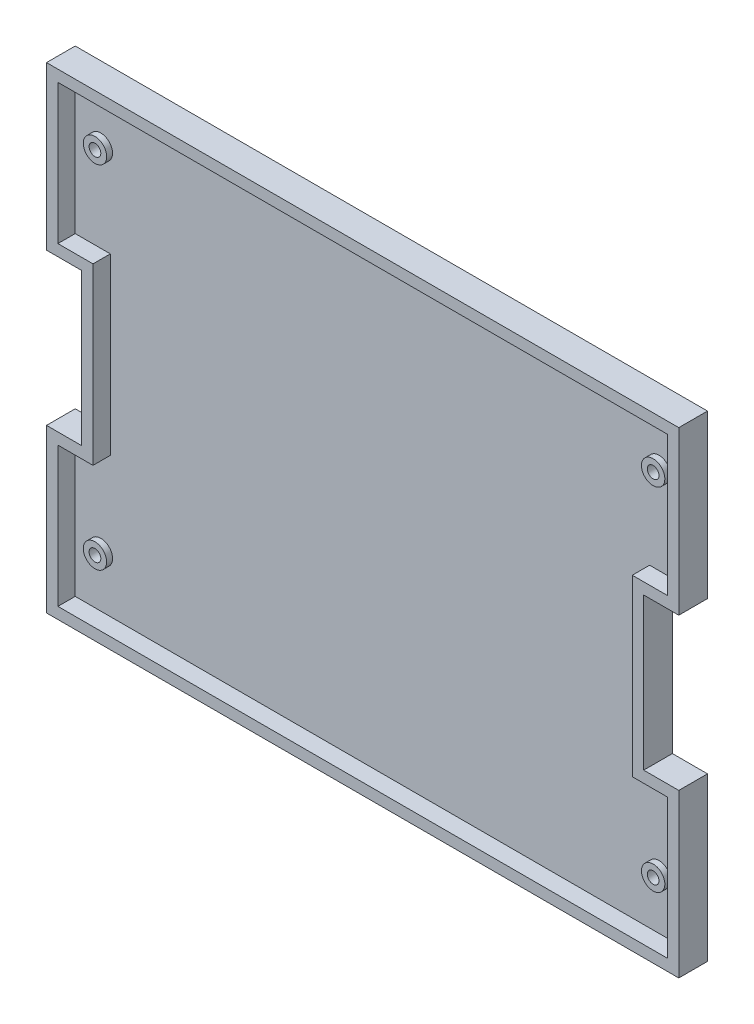
ISO-10303-21;
HEADER;
FILE_DESCRIPTION(('STEP AP214'),'2;1');
FILE_NAME('part.step','',(''),(''),'','','');
FILE_SCHEMA(('AUTOMOTIVE_DESIGN { 1 0 10303 214 1 1 1 1 }'));
ENDSEC;
DATA;
#1=APPLICATION_CONTEXT('core data for automotive mechanical design processes');
#2=APPLICATION_PROTOCOL_DEFINITION('international standard','automotive_design',2000,#1);
#3=PRODUCT_CONTEXT('',#1,'mechanical');
#4=PRODUCT('Part','Part','',(#3));
#5=PRODUCT_RELATED_PRODUCT_CATEGORY('part','',(#4));
#6=PRODUCT_DEFINITION_FORMATION('','',#4);
#7=PRODUCT_DEFINITION_CONTEXT('part definition',#1,'design');
#8=PRODUCT_DEFINITION('design','',#6,#7);
#9=PRODUCT_DEFINITION_SHAPE('','',#8);
#10=(LENGTH_UNIT() NAMED_UNIT(*) SI_UNIT(.MILLI.,.METRE.));
#11=(NAMED_UNIT(*) PLANE_ANGLE_UNIT() SI_UNIT($,.RADIAN.));
#12=(NAMED_UNIT(*) SI_UNIT($,.STERADIAN.) SOLID_ANGLE_UNIT());
#13=UNCERTAINTY_MEASURE_WITH_UNIT(LENGTH_MEASURE(1.E-05),#10,'distance_accuracy_value','');
#14=(GEOMETRIC_REPRESENTATION_CONTEXT(3) GLOBAL_UNCERTAINTY_ASSIGNED_CONTEXT((#13)) GLOBAL_UNIT_ASSIGNED_CONTEXT((#10,
#11,#12)) REPRESENTATION_CONTEXT('',''));
#15=CARTESIAN_POINT('',(0.,0.,0.));
#16=DIRECTION('',(0.,0.,1.));
#17=DIRECTION('',(1.,0.,0.));
#18=AXIS2_PLACEMENT_3D('',#15,#16,#17);
#19=CARTESIAN_POINT('',(0.,0.,4.91));
#20=DIRECTION('',(0.,0.,1.));
#21=DIRECTION('',(1.,0.,0.));
#22=AXIS2_PLACEMENT_3D('',#19,#20,#21);
#23=PLANE('',#22);
#24=DIRECTION('',(1.,0.,0.));
#25=VECTOR('',#24,1.);
#26=CARTESIAN_POINT('',(0.,-12.97,4.91));
#27=LINE('',#26,#25);
#28=CARTESIAN_POINT('',(48.055,-12.97,4.91));
#29=VERTEX_POINT('',#28);
#30=CARTESIAN_POINT('',(54.055,-12.97,4.91));
#31=VERTEX_POINT('',#30);
#32=EDGE_CURVE('E207',#29,#31,#27,.T.);
#33=ORIENTED_EDGE('',*,*,#32,.F.);
#34=DIRECTION('',(0.,1.,0.));
#35=VECTOR('',#34,1.);
#36=CARTESIAN_POINT('',(48.055,0.,4.91));
#37=LINE('',#36,#35);
#38=CARTESIAN_POINT('',(48.055,12.97,4.91));
#39=VERTEX_POINT('',#38);
#40=EDGE_CURVE('E204',#29,#39,#37,.T.);
#41=ORIENTED_EDGE('',*,*,#40,.T.);
#42=DIRECTION('',(1.,0.,0.));
#43=VECTOR('',#42,1.);
#44=CARTESIAN_POINT('',(0.,12.97,4.91));
#45=LINE('',#44,#43);
#46=CARTESIAN_POINT('',(54.055,12.97,4.91));
#47=VERTEX_POINT('',#46);
#48=EDGE_CURVE('E199',#39,#47,#45,.T.);
#49=ORIENTED_EDGE('',*,*,#48,.T.);
#50=DIRECTION('',(0.,1.,0.));
#51=VECTOR('',#50,1.);
#52=CARTESIAN_POINT('',(54.055,0.,4.91));
#53=LINE('',#52,#51);
#54=CARTESIAN_POINT('',(54.055,40.75,4.91));
#55=VERTEX_POINT('',#54);
#56=EDGE_CURVE('E195',#47,#55,#53,.T.);
#57=ORIENTED_EDGE('',*,*,#56,.T.);
#58=DIRECTION('',(1.,0.,0.));
#59=VECTOR('',#58,1.);
#60=CARTESIAN_POINT('',(0.,40.75,4.91));
#61=LINE('',#60,#59);
#62=CARTESIAN_POINT('',(-54.055,40.75,4.91));
#63=VERTEX_POINT('',#62);
#64=EDGE_CURVE('E188',#63,#55,#61,.T.);
#65=ORIENTED_EDGE('',*,*,#64,.F.);
#66=DIRECTION('',(0.,1.,0.));
#67=VECTOR('',#66,1.);
#68=CARTESIAN_POINT('',(-54.055,0.,4.91));
#69=LINE('',#68,#67);
#70=CARTESIAN_POINT('',(-54.055,12.97,4.91));
#71=VERTEX_POINT('',#70);
#72=EDGE_CURVE('E179',#71,#63,#69,.T.);
#73=ORIENTED_EDGE('',*,*,#72,.F.);
#74=DIRECTION('',(-1.,0.,0.));
#75=VECTOR('',#74,1.);
#76=CARTESIAN_POINT('',(0.,12.97,4.91));
#77=LINE('',#76,#75);
#78=CARTESIAN_POINT('',(-48.055,12.97,4.91));
#79=VERTEX_POINT('',#78);
#80=EDGE_CURVE('E187',#79,#71,#77,.T.);
#81=ORIENTED_EDGE('',*,*,#80,.F.);
#82=DIRECTION('',(0.,1.,0.));
#83=VECTOR('',#82,1.);
#84=CARTESIAN_POINT('',(-48.055,0.,4.91));
#85=LINE('',#84,#83);
#86=CARTESIAN_POINT('',(-48.055,-12.97,4.91));
#87=VERTEX_POINT('',#86);
#88=EDGE_CURVE('E181',#87,#79,#85,.T.);
#89=ORIENTED_EDGE('',*,*,#88,.F.);
#90=DIRECTION('',(-1.,0.,0.));
#91=VECTOR('',#90,1.);
#92=CARTESIAN_POINT('',(0.,-12.97,4.91));
#93=LINE('',#92,#91);
#94=CARTESIAN_POINT('',(-54.055,-12.97,4.91));
#95=VERTEX_POINT('',#94);
#96=EDGE_CURVE('E175',#87,#95,#93,.T.);
#97=ORIENTED_EDGE('',*,*,#96,.T.);
#98=CARTESIAN_POINT('',(-54.055,-40.75,4.91));
#99=VERTEX_POINT('',#98);
#100=EDGE_CURVE('E157',#99,#95,#69,.T.);
#101=ORIENTED_EDGE('',*,*,#100,.F.);
#102=DIRECTION('',(1.,0.,0.));
#103=VECTOR('',#102,1.);
#104=CARTESIAN_POINT('',(0.,-40.75,4.91));
#105=LINE('',#104,#103);
#106=CARTESIAN_POINT('',(54.055,-40.75,4.91));
#107=VERTEX_POINT('',#106);
#108=EDGE_CURVE('E167',#99,#107,#105,.T.);
#109=ORIENTED_EDGE('',*,*,#108,.T.);
#110=EDGE_CURVE('E74',#107,#31,#53,.T.);
#111=ORIENTED_EDGE('',*,*,#110,.T.);
#112=EDGE_LOOP('',(#33,#41,#49,#57,#65,#73,#81,#89,#97,#101,#109,#111));
#113=FACE_BOUND('',#112,.T.);
#114=DIRECTION('',(0.,1.,0.));
#115=VECTOR('',#114,1.);
#116=CARTESIAN_POINT('',(46.105,0.,4.91));
#117=LINE('',#116,#115);
#118=CARTESIAN_POINT('',(46.105,-14.92,4.91));
#119=VERTEX_POINT('',#118);
#120=CARTESIAN_POINT('',(46.105,14.92,4.91));
#121=VERTEX_POINT('',#120);
#122=EDGE_CURVE('E250',#119,#121,#117,.T.);
#123=ORIENTED_EDGE('',*,*,#122,.F.);
#124=DIRECTION('',(1.,0.,0.));
#125=VECTOR('',#124,1.);
#126=CARTESIAN_POINT('',(0.,-14.92,4.91));
#127=LINE('',#126,#125);
#128=CARTESIAN_POINT('',(52.105,-14.92,4.91));
#129=VERTEX_POINT('',#128);
#130=EDGE_CURVE('E254',#119,#129,#127,.T.);
#131=ORIENTED_EDGE('',*,*,#130,.T.);
#132=DIRECTION('',(0.,1.,0.));
#133=VECTOR('',#132,1.);
#134=CARTESIAN_POINT('',(52.105,0.,4.91));
#135=LINE('',#134,#133);
#136=CARTESIAN_POINT('',(52.105,-38.8,4.91));
#137=VERTEX_POINT('',#136);
#138=EDGE_CURVE('E211',#137,#129,#135,.T.);
#139=ORIENTED_EDGE('',*,*,#138,.F.);
#140=DIRECTION('',(1.,0.,0.));
#141=VECTOR('',#140,1.);
#142=CARTESIAN_POINT('',(0.,-38.8,4.91));
#143=LINE('',#142,#141);
#144=CARTESIAN_POINT('',(-52.105,-38.8,4.91));
#145=VERTEX_POINT('',#144);
#146=EDGE_CURVE('E215',#145,#137,#143,.T.);
#147=ORIENTED_EDGE('',*,*,#146,.F.);
#148=DIRECTION('',(0.,1.,0.));
#149=VECTOR('',#148,1.);
#150=CARTESIAN_POINT('',(-52.105,0.,4.91));
#151=LINE('',#150,#149);
#152=CARTESIAN_POINT('',(-52.105,-14.92,4.91));
#153=VERTEX_POINT('',#152);
#154=EDGE_CURVE('E218',#145,#153,#151,.T.);
#155=ORIENTED_EDGE('',*,*,#154,.T.);
#156=DIRECTION('',(-1.,0.,0.));
#157=VECTOR('',#156,1.);
#158=CARTESIAN_POINT('',(0.,-14.92,4.91));
#159=LINE('',#158,#157);
#160=CARTESIAN_POINT('',(-46.105,-14.92,4.91));
#161=VERTEX_POINT('',#160);
#162=EDGE_CURVE('E222',#161,#153,#159,.T.);
#163=ORIENTED_EDGE('',*,*,#162,.F.);
#164=DIRECTION('',(0.,1.,0.));
#165=VECTOR('',#164,1.);
#166=CARTESIAN_POINT('',(-46.105,0.,4.91));
#167=LINE('',#166,#165);
#168=CARTESIAN_POINT('',(-46.105,14.92,4.91));
#169=VERTEX_POINT('',#168);
#170=EDGE_CURVE('E226',#161,#169,#167,.T.);
#171=ORIENTED_EDGE('',*,*,#170,.T.);
#172=DIRECTION('',(-1.,0.,0.));
#173=VECTOR('',#172,1.);
#174=CARTESIAN_POINT('',(0.,14.92,4.91));
#175=LINE('',#174,#173);
#176=CARTESIAN_POINT('',(-52.105,14.92,4.91));
#177=VERTEX_POINT('',#176);
#178=EDGE_CURVE('E230',#169,#177,#175,.T.);
#179=ORIENTED_EDGE('',*,*,#178,.T.);
#180=DIRECTION('',(0.,1.,0.));
#181=VECTOR('',#180,1.);
#182=CARTESIAN_POINT('',(-52.105,0.,4.91));
#183=LINE('',#182,#181);
#184=CARTESIAN_POINT('',(-52.105,38.8,4.91));
#185=VERTEX_POINT('',#184);
#186=EDGE_CURVE('E234',#177,#185,#183,.T.);
#187=ORIENTED_EDGE('',*,*,#186,.T.);
#188=DIRECTION('',(1.,0.,0.));
#189=VECTOR('',#188,1.);
#190=CARTESIAN_POINT('',(0.,38.8,4.91));
#191=LINE('',#190,#189);
#192=CARTESIAN_POINT('',(52.105,38.8,4.91));
#193=VERTEX_POINT('',#192);
#194=EDGE_CURVE('E238',#185,#193,#191,.T.);
#195=ORIENTED_EDGE('',*,*,#194,.T.);
#196=DIRECTION('',(0.,1.,0.));
#197=VECTOR('',#196,1.);
#198=CARTESIAN_POINT('',(52.105,0.,4.91));
#199=LINE('',#198,#197);
#200=CARTESIAN_POINT('',(52.105,14.92,4.91));
#201=VERTEX_POINT('',#200);
#202=EDGE_CURVE('E242',#201,#193,#199,.T.);
#203=ORIENTED_EDGE('',*,*,#202,.F.);
#204=DIRECTION('',(1.,0.,0.));
#205=VECTOR('',#204,1.);
#206=CARTESIAN_POINT('',(0.,14.92,4.91));
#207=LINE('',#206,#205);
#208=EDGE_CURVE('E246',#121,#201,#207,.T.);
#209=ORIENTED_EDGE('',*,*,#208,.F.);
#210=EDGE_LOOP('',(#123,#131,#139,#147,#155,#163,#171,#179,#187,#195,#203,#209));
#211=FACE_BOUND('',#210,.T.);
#212=ADVANCED_FACE('F47',(#113,#211),#23,.T.);
#213=CARTESIAN_POINT('',(0.,-12.97,4.91));
#214=DIRECTION('',(0.,1.,0.));
#215=DIRECTION('',(0.,0.,1.));
#216=AXIS2_PLACEMENT_3D('',#213,#214,#215);
#217=PLANE('',#216);
#218=DIRECTION('',(1.,0.,0.));
#219=VECTOR('',#218,1.);
#220=CARTESIAN_POINT('',(0.,-12.97,0.));
#221=LINE('',#220,#219);
#222=CARTESIAN_POINT('',(48.055,-12.97,0.));
#223=VERTEX_POINT('',#222);
#224=CARTESIAN_POINT('',(54.055,-12.97,0.));
#225=VERTEX_POINT('',#224);
#226=EDGE_CURVE('E348',#223,#225,#221,.T.);
#227=ORIENTED_EDGE('',*,*,#226,.F.);
#228=DIRECTION('',(0.,0.,-1.));
#229=VECTOR('',#228,1.);
#230=CARTESIAN_POINT('',(48.055,-12.97,4.91));
#231=LINE('',#230,#229);
#232=EDGE_CURVE('E11',#29,#223,#231,.T.);
#233=ORIENTED_EDGE('',*,*,#232,.F.);
#234=ORIENTED_EDGE('',*,*,#32,.T.);
#235=DIRECTION('',(0.,0.,-1.));
#236=VECTOR('',#235,1.);
#237=CARTESIAN_POINT('',(54.055,-12.97,4.91));
#238=LINE('',#237,#236);
#239=EDGE_CURVE('E118',#31,#225,#238,.T.);
#240=ORIENTED_EDGE('',*,*,#239,.T.);
#241=EDGE_LOOP('',(#227,#233,#234,#240));
#242=FACE_BOUND('',#241,.T.);
#243=ADVANCED_FACE('F49',(#242),#217,.T.);
#244=CARTESIAN_POINT('',(48.055,0.,4.91));
#245=DIRECTION('',(-1.,0.,0.));
#246=DIRECTION('',(0.,0.,1.));
#247=AXIS2_PLACEMENT_3D('',#244,#245,#246);
#248=PLANE('',#247);
#249=DIRECTION('',(0.,1.,0.));
#250=VECTOR('',#249,1.);
#251=CARTESIAN_POINT('',(48.055,0.,0.));
#252=LINE('',#251,#250);
#253=CARTESIAN_POINT('',(48.055,12.97,0.));
#254=VERTEX_POINT('',#253);
#255=EDGE_CURVE('E481',#223,#254,#252,.T.);
#256=ORIENTED_EDGE('',*,*,#255,.T.);
#257=DIRECTION('',(0.,0.,-1.));
#258=VECTOR('',#257,1.);
#259=CARTESIAN_POINT('',(48.055,12.97,4.91));
#260=LINE('',#259,#258);
#261=EDGE_CURVE('E57',#39,#254,#260,.T.);
#262=ORIENTED_EDGE('',*,*,#261,.F.);
#263=ORIENTED_EDGE('',*,*,#40,.F.);
#264=ORIENTED_EDGE('',*,*,#232,.T.);
#265=EDGE_LOOP('',(#256,#262,#263,#264));
#266=FACE_BOUND('',#265,.T.);
#267=ADVANCED_FACE('F438',(#266),#248,.F.);
#268=CARTESIAN_POINT('',(0.,12.97,4.91));
#269=DIRECTION('',(0.,1.,0.));
#270=DIRECTION('',(-1.,0.,0.));
#271=AXIS2_PLACEMENT_3D('',#268,#269,#270);
#272=PLANE('',#271);
#273=DIRECTION('',(1.,0.,0.));
#274=VECTOR('',#273,1.);
#275=CARTESIAN_POINT('',(0.,12.97,0.));
#276=LINE('',#275,#274);
#277=CARTESIAN_POINT('',(54.055,12.97,0.));
#278=VERTEX_POINT('',#277);
#279=EDGE_CURVE('E488',#254,#278,#276,.T.);
#280=ORIENTED_EDGE('',*,*,#279,.T.);
#281=DIRECTION('',(0.,0.,-1.));
#282=VECTOR('',#281,1.);
#283=CARTESIAN_POINT('',(54.055,12.97,4.91));
#284=LINE('',#283,#282);
#285=EDGE_CURVE('E493',#47,#278,#284,.T.);
#286=ORIENTED_EDGE('',*,*,#285,.F.);
#287=ORIENTED_EDGE('',*,*,#48,.F.);
#288=ORIENTED_EDGE('',*,*,#261,.T.);
#289=EDGE_LOOP('',(#280,#286,#287,#288));
#290=FACE_BOUND('',#289,.T.);
#291=ADVANCED_FACE('F472',(#290),#272,.F.);
#292=CARTESIAN_POINT('',(54.055,0.,4.91));
#293=DIRECTION('',(-1.,0.,0.));
#294=DIRECTION('',(0.,0.,1.));
#295=AXIS2_PLACEMENT_3D('',#292,#293,#294);
#296=PLANE('',#295);
#297=DIRECTION('',(0.,1.,0.));
#298=VECTOR('',#297,1.);
#299=CARTESIAN_POINT('',(54.055,0.,0.));
#300=LINE('',#299,#298);
#301=CARTESIAN_POINT('',(54.055,40.75,0.));
#302=VERTEX_POINT('',#301);
#303=EDGE_CURVE('E498',#278,#302,#300,.T.);
#304=ORIENTED_EDGE('',*,*,#303,.T.);
#305=DIRECTION('',(0.,0.,-1.));
#306=VECTOR('',#305,1.);
#307=CARTESIAN_POINT('',(54.055,40.75,4.91));
#308=LINE('',#307,#306);
#309=EDGE_CURVE('E545',#55,#302,#308,.T.);
#310=ORIENTED_EDGE('',*,*,#309,.F.);
#311=ORIENTED_EDGE('',*,*,#56,.F.);
#312=ORIENTED_EDGE('',*,*,#285,.T.);
#313=EDGE_LOOP('',(#304,#310,#311,#312));
#314=FACE_BOUND('',#313,.T.);
#315=ADVANCED_FACE('F451',(#314),#296,.F.);
#316=CARTESIAN_POINT('',(0.,40.75,4.91));
#317=DIRECTION('',(0.,1.,0.));
#318=DIRECTION('',(0.,0.,1.));
#319=AXIS2_PLACEMENT_3D('',#316,#317,#318);
#320=PLANE('',#319);
#321=DIRECTION('',(1.,0.,0.));
#322=VECTOR('',#321,1.);
#323=CARTESIAN_POINT('',(0.,40.75,0.));
#324=LINE('',#323,#322);
#325=CARTESIAN_POINT('',(-54.055,40.75,0.));
#326=VERTEX_POINT('',#325);
#327=EDGE_CURVE('E502',#326,#302,#324,.T.);
#328=ORIENTED_EDGE('',*,*,#327,.F.);
#329=DIRECTION('',(0.,0.,-1.));
#330=VECTOR('',#329,1.);
#331=CARTESIAN_POINT('',(-54.055,40.75,4.91));
#332=LINE('',#331,#330);
#333=EDGE_CURVE('E542',#63,#326,#332,.T.);
#334=ORIENTED_EDGE('',*,*,#333,.F.);
#335=ORIENTED_EDGE('',*,*,#64,.T.);
#336=ORIENTED_EDGE('',*,*,#309,.T.);
#337=EDGE_LOOP('',(#328,#334,#335,#336));
#338=FACE_BOUND('',#337,.T.);
#339=ADVANCED_FACE('F469',(#338),#320,.T.);
#340=CARTESIAN_POINT('',(-54.055,0.,4.91));
#341=DIRECTION('',(-1.,0.,0.));
#342=DIRECTION('',(0.,0.,1.));
#343=AXIS2_PLACEMENT_3D('',#340,#341,#342);
#344=PLANE('',#343);
#345=DIRECTION('',(0.,1.,0.));
#346=VECTOR('',#345,1.);
#347=CARTESIAN_POINT('',(-54.055,0.,0.));
#348=LINE('',#347,#346);
#349=CARTESIAN_POINT('',(-54.055,12.97,0.));
#350=VERTEX_POINT('',#349);
#351=EDGE_CURVE('E508',#350,#326,#348,.T.);
#352=ORIENTED_EDGE('',*,*,#351,.F.);
#353=DIRECTION('',(0.,0.,-1.));
#354=VECTOR('',#353,1.);
#355=CARTESIAN_POINT('',(-54.055,12.97,4.91));
#356=LINE('',#355,#354);
#357=EDGE_CURVE('E539',#71,#350,#356,.T.);
#358=ORIENTED_EDGE('',*,*,#357,.F.);
#359=ORIENTED_EDGE('',*,*,#72,.T.);
#360=ORIENTED_EDGE('',*,*,#333,.T.);
#361=EDGE_LOOP('',(#352,#358,#359,#360));
#362=FACE_BOUND('',#361,.T.);
#363=ADVANCED_FACE('F457',(#362),#344,.T.);
#364=CARTESIAN_POINT('',(0.,12.97,4.91));
#365=DIRECTION('',(0.,-1.,0.));
#366=DIRECTION('',(1.,0.,0.));
#367=AXIS2_PLACEMENT_3D('',#364,#365,#366);
#368=PLANE('',#367);
#369=DIRECTION('',(-1.,0.,0.));
#370=VECTOR('',#369,1.);
#371=CARTESIAN_POINT('',(0.,12.97,0.));
#372=LINE('',#371,#370);
#373=CARTESIAN_POINT('',(-48.055,12.97,0.));
#374=VERTEX_POINT('',#373);
#375=EDGE_CURVE('E512',#374,#350,#372,.T.);
#376=ORIENTED_EDGE('',*,*,#375,.F.);
#377=DIRECTION('',(0.,0.,-1.));
#378=VECTOR('',#377,1.);
#379=CARTESIAN_POINT('',(-48.055,12.97,4.91));
#380=LINE('',#379,#378);
#381=EDGE_CURVE('E536',#79,#374,#380,.T.);
#382=ORIENTED_EDGE('',*,*,#381,.F.);
#383=ORIENTED_EDGE('',*,*,#80,.T.);
#384=ORIENTED_EDGE('',*,*,#357,.T.);
#385=EDGE_LOOP('',(#376,#382,#383,#384));
#386=FACE_BOUND('',#385,.T.);
#387=ADVANCED_FACE('F464',(#386),#368,.T.);
#388=CARTESIAN_POINT('',(-48.055,0.,4.91));
#389=DIRECTION('',(-1.,0.,0.));
#390=DIRECTION('',(0.,0.,1.));
#391=AXIS2_PLACEMENT_3D('',#388,#389,#390);
#392=PLANE('',#391);
#393=DIRECTION('',(0.,1.,0.));
#394=VECTOR('',#393,1.);
#395=CARTESIAN_POINT('',(-48.055,0.,0.));
#396=LINE('',#395,#394);
#397=CARTESIAN_POINT('',(-48.055,-12.97,0.));
#398=VERTEX_POINT('',#397);
#399=EDGE_CURVE('E516',#398,#374,#396,.T.);
#400=ORIENTED_EDGE('',*,*,#399,.F.);
#401=DIRECTION('',(0.,0.,-1.));
#402=VECTOR('',#401,1.);
#403=CARTESIAN_POINT('',(-48.055,-12.97,4.91));
#404=LINE('',#403,#402);
#405=EDGE_CURVE('E533',#87,#398,#404,.T.);
#406=ORIENTED_EDGE('',*,*,#405,.F.);
#407=ORIENTED_EDGE('',*,*,#88,.T.);
#408=ORIENTED_EDGE('',*,*,#381,.T.);
#409=EDGE_LOOP('',(#400,#406,#407,#408));
#410=FACE_BOUND('',#409,.T.);
#411=ADVANCED_FACE('F460',(#410),#392,.T.);
#412=CARTESIAN_POINT('',(0.,-12.97,4.91));
#413=DIRECTION('',(0.,-1.,0.));
#414=DIRECTION('',(0.,0.,-1.));
#415=AXIS2_PLACEMENT_3D('',#412,#413,#414);
#416=PLANE('',#415);
#417=DIRECTION('',(-1.,0.,0.));
#418=VECTOR('',#417,1.);
#419=CARTESIAN_POINT('',(0.,-12.97,0.));
#420=LINE('',#419,#418);
#421=CARTESIAN_POINT('',(-54.055,-12.97,0.));
#422=VERTEX_POINT('',#421);
#423=EDGE_CURVE('E520',#398,#422,#420,.T.);
#424=ORIENTED_EDGE('',*,*,#423,.T.);
#425=DIRECTION('',(0.,0.,-1.));
#426=VECTOR('',#425,1.);
#427=CARTESIAN_POINT('',(-54.055,-12.97,4.91));
#428=LINE('',#427,#426);
#429=EDGE_CURVE('E163',#95,#422,#428,.T.);
#430=ORIENTED_EDGE('',*,*,#429,.F.);
#431=ORIENTED_EDGE('',*,*,#96,.F.);
#432=ORIENTED_EDGE('',*,*,#405,.T.);
#433=EDGE_LOOP('',(#424,#430,#431,#432));
#434=FACE_BOUND('',#433,.T.);
#435=ADVANCED_FACE('F456',(#434),#416,.F.);
#436=CARTESIAN_POINT('',(-54.055,-40.75,0.));
#437=VERTEX_POINT('',#436);
#438=EDGE_CURVE('E159',#437,#422,#348,.T.);
#439=ORIENTED_EDGE('',*,*,#438,.F.);
#440=DIRECTION('',(0.,0.,-1.));
#441=VECTOR('',#440,1.);
#442=CARTESIAN_POINT('',(-54.055,-40.75,4.91));
#443=LINE('',#442,#441);
#444=EDGE_CURVE('E153',#99,#437,#443,.T.);
#445=ORIENTED_EDGE('',*,*,#444,.F.);
#446=ORIENTED_EDGE('',*,*,#100,.T.);
#447=ORIENTED_EDGE('',*,*,#429,.T.);
#448=EDGE_LOOP('',(#439,#445,#446,#447));
#449=FACE_BOUND('',#448,.T.);
#450=ADVANCED_FACE('F155',(#449),#344,.T.);
#451=CARTESIAN_POINT('',(0.,-40.75,4.91));
#452=DIRECTION('',(0.,1.,0.));
#453=DIRECTION('',(0.,0.,1.));
#454=AXIS2_PLACEMENT_3D('',#451,#452,#453);
#455=PLANE('',#454);
#456=DIRECTION('',(1.,0.,0.));
#457=VECTOR('',#456,1.);
#458=CARTESIAN_POINT('',(0.,-40.75,0.));
#459=LINE('',#458,#457);
#460=CARTESIAN_POINT('',(54.055,-40.75,0.));
#461=VERTEX_POINT('',#460);
#462=EDGE_CURVE('E524',#437,#461,#459,.T.);
#463=ORIENTED_EDGE('',*,*,#462,.T.);
#464=DIRECTION('',(0.,0.,-1.));
#465=VECTOR('',#464,1.);
#466=CARTESIAN_POINT('',(54.055,-40.75,4.91));
#467=LINE('',#466,#465);
#468=EDGE_CURVE('E164',#107,#461,#467,.T.);
#469=ORIENTED_EDGE('',*,*,#468,.F.);
#470=ORIENTED_EDGE('',*,*,#108,.F.);
#471=ORIENTED_EDGE('',*,*,#444,.T.);
#472=EDGE_LOOP('',(#463,#469,#470,#471));
#473=FACE_BOUND('',#472,.T.);
#474=ADVANCED_FACE('F168',(#473),#455,.F.);
#475=EDGE_CURVE('E210',#461,#225,#300,.T.);
#476=ORIENTED_EDGE('',*,*,#475,.T.);
#477=ORIENTED_EDGE('',*,*,#239,.F.);
#478=ORIENTED_EDGE('',*,*,#110,.F.);
#479=ORIENTED_EDGE('',*,*,#468,.T.);
#480=EDGE_LOOP('',(#476,#477,#478,#479));
#481=FACE_BOUND('',#480,.T.);
#482=ADVANCED_FACE('F447',(#481),#296,.F.);
#483=CARTESIAN_POINT('',(0.,0.,0.));
#484=DIRECTION('',(0.,0.,1.));
#485=DIRECTION('',(1.,0.,0.));
#486=AXIS2_PLACEMENT_3D('',#483,#484,#485);
#487=PLANE('',#486);
#488=CARTESIAN_POINT('',(-47.72,-30.01,0.));
#489=DIRECTION('',(0.,0.,1.));
#490=DIRECTION('',(1.,0.,0.));
#491=AXIS2_PLACEMENT_3D('',#488,#489,#490);
#492=CIRCLE('',#491,0.999999999999998);
#493=CARTESIAN_POINT('',(-46.72,-30.01,0.));
#494=VERTEX_POINT('',#493);
#495=EDGE_CURVE('E386',#494,#494,#492,.F.);
#496=ORIENTED_EDGE('',*,*,#495,.F.);
#497=EDGE_LOOP('',(#496));
#498=FACE_BOUND('',#497,.T.);
#499=CARTESIAN_POINT('',(47.72,-30.01,0.));
#500=DIRECTION('',(0.,0.,1.));
#501=DIRECTION('',(1.,0.,0.));
#502=AXIS2_PLACEMENT_3D('',#499,#500,#501);
#503=CIRCLE('',#502,0.999999999999998);
#504=CARTESIAN_POINT('',(48.72,-30.01,0.));
#505=VERTEX_POINT('',#504);
#506=EDGE_CURVE('E381',#505,#505,#503,.F.);
#507=ORIENTED_EDGE('',*,*,#506,.F.);
#508=EDGE_LOOP('',(#507));
#509=FACE_BOUND('',#508,.T.);
#510=CARTESIAN_POINT('',(47.72,30.01,0.));
#511=DIRECTION('',(0.,0.,1.));
#512=DIRECTION('',(1.,0.,0.));
#513=AXIS2_PLACEMENT_3D('',#510,#511,#512);
#514=CIRCLE('',#513,0.999999999999998);
#515=CARTESIAN_POINT('',(48.72,30.01,0.));
#516=VERTEX_POINT('',#515);
#517=EDGE_CURVE('E376',#516,#516,#514,.F.);
#518=ORIENTED_EDGE('',*,*,#517,.F.);
#519=EDGE_LOOP('',(#518));
#520=FACE_BOUND('',#519,.T.);
#521=CARTESIAN_POINT('',(-47.72,30.01,0.));
#522=DIRECTION('',(0.,0.,1.));
#523=DIRECTION('',(1.,0.,0.));
#524=AXIS2_PLACEMENT_3D('',#521,#522,#523);
#525=CIRCLE('',#524,0.999999999999998);
#526=CARTESIAN_POINT('',(-46.72,30.01,0.));
#527=VERTEX_POINT('',#526);
#528=EDGE_CURVE('E372',#527,#527,#525,.F.);
#529=ORIENTED_EDGE('',*,*,#528,.F.);
#530=EDGE_LOOP('',(#529));
#531=FACE_BOUND('',#530,.T.);
#532=ORIENTED_EDGE('',*,*,#226,.T.);
#533=ORIENTED_EDGE('',*,*,#475,.F.);
#534=ORIENTED_EDGE('',*,*,#462,.F.);
#535=ORIENTED_EDGE('',*,*,#438,.T.);
#536=ORIENTED_EDGE('',*,*,#423,.F.);
#537=ORIENTED_EDGE('',*,*,#399,.T.);
#538=ORIENTED_EDGE('',*,*,#375,.T.);
#539=ORIENTED_EDGE('',*,*,#351,.T.);
#540=ORIENTED_EDGE('',*,*,#327,.T.);
#541=ORIENTED_EDGE('',*,*,#303,.F.);
#542=ORIENTED_EDGE('',*,*,#279,.F.);
#543=ORIENTED_EDGE('',*,*,#255,.F.);
#544=EDGE_LOOP('',(#532,#533,#534,#535,#536,#537,#538,#539,#540,#541,#542,#543));
#545=FACE_BOUND('',#544,.T.);
#546=ADVANCED_FACE('F443',(#498,#509,#520,#531,#545),#487,.F.);
#547=CARTESIAN_POINT('',(0.,-14.92,4.91));
#548=DIRECTION('',(0.,1.,0.));
#549=DIRECTION('',(0.,0.,1.));
#550=AXIS2_PLACEMENT_3D('',#547,#548,#549);
#551=PLANE('',#550);
#552=DIRECTION('',(1.,0.,0.));
#553=VECTOR('',#552,1.);
#554=CARTESIAN_POINT('',(0.,-14.92,1.95));
#555=LINE('',#554,#553);
#556=CARTESIAN_POINT('',(46.105,-14.92,1.95));
#557=VERTEX_POINT('',#556);
#558=CARTESIAN_POINT('',(52.105,-14.92,1.95));
#559=VERTEX_POINT('',#558);
#560=EDGE_CURVE('E341',#557,#559,#555,.T.);
#561=ORIENTED_EDGE('',*,*,#560,.T.);
#562=DIRECTION('',(0.,0.,-1.));
#563=VECTOR('',#562,1.);
#564=CARTESIAN_POINT('',(52.105,-14.92,4.91));
#565=LINE('',#564,#563);
#566=EDGE_CURVE('E214',#129,#559,#565,.T.);
#567=ORIENTED_EDGE('',*,*,#566,.F.);
#568=ORIENTED_EDGE('',*,*,#130,.F.);
#569=DIRECTION('',(0.,0.,-1.));
#570=VECTOR('',#569,1.);
#571=CARTESIAN_POINT('',(46.105,-14.92,4.91));
#572=LINE('',#571,#570);
#573=EDGE_CURVE('E337',#119,#557,#572,.T.);
#574=ORIENTED_EDGE('',*,*,#573,.T.);
#575=EDGE_LOOP('',(#561,#567,#568,#574));
#576=FACE_BOUND('',#575,.T.);
#577=ADVANCED_FACE('F446',(#576),#551,.F.);
#578=CARTESIAN_POINT('',(46.105,0.,4.91));
#579=DIRECTION('',(-1.,0.,0.));
#580=DIRECTION('',(0.,0.,1.));
#581=AXIS2_PLACEMENT_3D('',#578,#579,#580);
#582=PLANE('',#581);
#583=DIRECTION('',(0.,1.,0.));
#584=VECTOR('',#583,1.);
#585=CARTESIAN_POINT('',(46.105,0.,1.95));
#586=LINE('',#585,#584);
#587=CARTESIAN_POINT('',(46.105,14.92,1.95));
#588=VERTEX_POINT('',#587);
#589=EDGE_CURVE('E333',#557,#588,#586,.T.);
#590=ORIENTED_EDGE('',*,*,#589,.F.);
#591=ORIENTED_EDGE('',*,*,#573,.F.);
#592=ORIENTED_EDGE('',*,*,#122,.T.);
#593=DIRECTION('',(0.,0.,-1.));
#594=VECTOR('',#593,1.);
#595=CARTESIAN_POINT('',(46.105,14.92,4.91));
#596=LINE('',#595,#594);
#597=EDGE_CURVE('E329',#121,#588,#596,.T.);
#598=ORIENTED_EDGE('',*,*,#597,.T.);
#599=EDGE_LOOP('',(#590,#591,#592,#598));
#600=FACE_BOUND('',#599,.T.);
#601=ADVANCED_FACE('F744',(#600),#582,.T.);
#602=CARTESIAN_POINT('',(0.,14.92,4.91));
#603=DIRECTION('',(0.,1.,0.));
#604=DIRECTION('',(-1.,0.,0.));
#605=AXIS2_PLACEMENT_3D('',#602,#603,#604);
#606=PLANE('',#605);
#607=DIRECTION('',(1.,0.,0.));
#608=VECTOR('',#607,1.);
#609=CARTESIAN_POINT('',(0.,14.92,1.95));
#610=LINE('',#609,#608);
#611=CARTESIAN_POINT('',(52.105,14.92,1.95));
#612=VERTEX_POINT('',#611);
#613=EDGE_CURVE('E325',#588,#612,#610,.T.);
#614=ORIENTED_EDGE('',*,*,#613,.F.);
#615=ORIENTED_EDGE('',*,*,#597,.F.);
#616=ORIENTED_EDGE('',*,*,#208,.T.);
#617=DIRECTION('',(0.,0.,-1.));
#618=VECTOR('',#617,1.);
#619=CARTESIAN_POINT('',(52.105,14.92,4.91));
#620=LINE('',#619,#618);
#621=EDGE_CURVE('E321',#201,#612,#620,.T.);
#622=ORIENTED_EDGE('',*,*,#621,.T.);
#623=EDGE_LOOP('',(#614,#615,#616,#622));
#624=FACE_BOUND('',#623,.T.);
#625=ADVANCED_FACE('F736',(#624),#606,.T.);
#626=CARTESIAN_POINT('',(52.105,0.,4.91));
#627=DIRECTION('',(-1.,0.,0.));
#628=DIRECTION('',(0.,0.,1.));
#629=AXIS2_PLACEMENT_3D('',#626,#627,#628);
#630=PLANE('',#629);
#631=DIRECTION('',(0.,1.,0.));
#632=VECTOR('',#631,1.);
#633=CARTESIAN_POINT('',(52.105,0.,1.95));
#634=LINE('',#633,#632);
#635=CARTESIAN_POINT('',(52.105,38.8,1.95));
#636=VERTEX_POINT('',#635);
#637=EDGE_CURVE('E317',#612,#636,#634,.T.);
#638=ORIENTED_EDGE('',*,*,#637,.F.);
#639=ORIENTED_EDGE('',*,*,#621,.F.);
#640=ORIENTED_EDGE('',*,*,#202,.T.);
#641=DIRECTION('',(0.,0.,-1.));
#642=VECTOR('',#641,1.);
#643=CARTESIAN_POINT('',(52.105,38.8,4.91));
#644=LINE('',#643,#642);
#645=EDGE_CURVE('E313',#193,#636,#644,.T.);
#646=ORIENTED_EDGE('',*,*,#645,.T.);
#647=EDGE_LOOP('',(#638,#639,#640,#646));
#648=FACE_BOUND('',#647,.T.);
#649=ADVANCED_FACE('F669',(#648),#630,.T.);
#650=CARTESIAN_POINT('',(0.,38.8,4.91));
#651=DIRECTION('',(0.,1.,0.));
#652=DIRECTION('',(0.,0.,1.));
#653=AXIS2_PLACEMENT_3D('',#650,#651,#652);
#654=PLANE('',#653);
#655=DIRECTION('',(1.,0.,0.));
#656=VECTOR('',#655,1.);
#657=CARTESIAN_POINT('',(0.,38.8,1.95));
#658=LINE('',#657,#656);
#659=CARTESIAN_POINT('',(-52.105,38.8,1.95));
#660=VERTEX_POINT('',#659);
#661=EDGE_CURVE('E309',#660,#636,#658,.T.);
#662=ORIENTED_EDGE('',*,*,#661,.T.);
#663=ORIENTED_EDGE('',*,*,#645,.F.);
#664=ORIENTED_EDGE('',*,*,#194,.F.);
#665=DIRECTION('',(0.,0.,-1.));
#666=VECTOR('',#665,1.);
#667=CARTESIAN_POINT('',(-52.105,38.8,4.91));
#668=LINE('',#667,#666);
#669=EDGE_CURVE('E305',#185,#660,#668,.T.);
#670=ORIENTED_EDGE('',*,*,#669,.T.);
#671=EDGE_LOOP('',(#662,#663,#664,#670));
#672=FACE_BOUND('',#671,.T.);
#673=ADVANCED_FACE('F720',(#672),#654,.F.);
#674=CARTESIAN_POINT('',(-52.105,0.,4.91));
#675=DIRECTION('',(-1.,0.,0.));
#676=DIRECTION('',(0.,0.,1.));
#677=AXIS2_PLACEMENT_3D('',#674,#675,#676);
#678=PLANE('',#677);
#679=DIRECTION('',(0.,1.,0.));
#680=VECTOR('',#679,1.);
#681=CARTESIAN_POINT('',(-52.105,0.,1.95));
#682=LINE('',#681,#680);
#683=CARTESIAN_POINT('',(-52.105,14.92,1.95));
#684=VERTEX_POINT('',#683);
#685=EDGE_CURVE('E301',#684,#660,#682,.T.);
#686=ORIENTED_EDGE('',*,*,#685,.T.);
#687=ORIENTED_EDGE('',*,*,#669,.F.);
#688=ORIENTED_EDGE('',*,*,#186,.F.);
#689=DIRECTION('',(0.,0.,-1.));
#690=VECTOR('',#689,1.);
#691=CARTESIAN_POINT('',(-52.105,14.92,4.91));
#692=LINE('',#691,#690);
#693=EDGE_CURVE('E297',#177,#684,#692,.T.);
#694=ORIENTED_EDGE('',*,*,#693,.T.);
#695=EDGE_LOOP('',(#686,#687,#688,#694));
#696=FACE_BOUND('',#695,.T.);
#697=ADVANCED_FACE('F687',(#696),#678,.F.);
#698=CARTESIAN_POINT('',(0.,14.92,4.91));
#699=DIRECTION('',(0.,-1.,0.));
#700=DIRECTION('',(1.,0.,0.));
#701=AXIS2_PLACEMENT_3D('',#698,#699,#700);
#702=PLANE('',#701);
#703=DIRECTION('',(-1.,0.,0.));
#704=VECTOR('',#703,1.);
#705=CARTESIAN_POINT('',(0.,14.92,1.95));
#706=LINE('',#705,#704);
#707=CARTESIAN_POINT('',(-46.105,14.92,1.95));
#708=VERTEX_POINT('',#707);
#709=EDGE_CURVE('E293',#708,#684,#706,.T.);
#710=ORIENTED_EDGE('',*,*,#709,.T.);
#711=ORIENTED_EDGE('',*,*,#693,.F.);
#712=ORIENTED_EDGE('',*,*,#178,.F.);
#713=DIRECTION('',(0.,0.,-1.));
#714=VECTOR('',#713,1.);
#715=CARTESIAN_POINT('',(-46.105,14.92,4.91));
#716=LINE('',#715,#714);
#717=EDGE_CURVE('E289',#169,#708,#716,.T.);
#718=ORIENTED_EDGE('',*,*,#717,.T.);
#719=EDGE_LOOP('',(#710,#711,#712,#718));
#720=FACE_BOUND('',#719,.T.);
#721=ADVANCED_FACE('F703',(#720),#702,.F.);
#722=CARTESIAN_POINT('',(-46.105,0.,4.91));
#723=DIRECTION('',(-1.,0.,0.));
#724=DIRECTION('',(0.,0.,1.));
#725=AXIS2_PLACEMENT_3D('',#722,#723,#724);
#726=PLANE('',#725);
#727=DIRECTION('',(0.,1.,0.));
#728=VECTOR('',#727,1.);
#729=CARTESIAN_POINT('',(-46.105,0.,1.95));
#730=LINE('',#729,#728);
#731=CARTESIAN_POINT('',(-46.105,-14.92,1.95));
#732=VERTEX_POINT('',#731);
#733=EDGE_CURVE('E285',#732,#708,#730,.T.);
#734=ORIENTED_EDGE('',*,*,#733,.T.);
#735=ORIENTED_EDGE('',*,*,#717,.F.);
#736=ORIENTED_EDGE('',*,*,#170,.F.);
#737=DIRECTION('',(0.,0.,-1.));
#738=VECTOR('',#737,1.);
#739=CARTESIAN_POINT('',(-46.105,-14.92,4.91));
#740=LINE('',#739,#738);
#741=EDGE_CURVE('E281',#161,#732,#740,.T.);
#742=ORIENTED_EDGE('',*,*,#741,.T.);
#743=EDGE_LOOP('',(#734,#735,#736,#742));
#744=FACE_BOUND('',#743,.T.);
#745=ADVANCED_FACE('F694',(#744),#726,.F.);
#746=CARTESIAN_POINT('',(0.,-14.92,4.91));
#747=DIRECTION('',(0.,-1.,0.));
#748=DIRECTION('',(0.,0.,-1.));
#749=AXIS2_PLACEMENT_3D('',#746,#747,#748);
#750=PLANE('',#749);
#751=DIRECTION('',(-1.,0.,0.));
#752=VECTOR('',#751,1.);
#753=CARTESIAN_POINT('',(0.,-14.92,1.95));
#754=LINE('',#753,#752);
#755=CARTESIAN_POINT('',(-52.105,-14.92,1.95));
#756=VERTEX_POINT('',#755);
#757=EDGE_CURVE('E277',#732,#756,#754,.T.);
#758=ORIENTED_EDGE('',*,*,#757,.F.);
#759=ORIENTED_EDGE('',*,*,#741,.F.);
#760=ORIENTED_EDGE('',*,*,#162,.T.);
#761=DIRECTION('',(0.,0.,-1.));
#762=VECTOR('',#761,1.);
#763=CARTESIAN_POINT('',(-52.105,-14.92,4.91));
#764=LINE('',#763,#762);
#765=EDGE_CURVE('E273',#153,#756,#764,.T.);
#766=ORIENTED_EDGE('',*,*,#765,.T.);
#767=EDGE_LOOP('',(#758,#759,#760,#766));
#768=FACE_BOUND('',#767,.T.);
#769=ADVANCED_FACE('F684',(#768),#750,.T.);
#770=DIRECTION('',(0.,1.,0.));
#771=VECTOR('',#770,1.);
#772=CARTESIAN_POINT('',(-52.105,0.,1.95));
#773=LINE('',#772,#771);
#774=CARTESIAN_POINT('',(-52.105,-38.8,1.95));
#775=VERTEX_POINT('',#774);
#776=EDGE_CURVE('E269',#775,#756,#773,.T.);
#777=ORIENTED_EDGE('',*,*,#776,.T.);
#778=ORIENTED_EDGE('',*,*,#765,.F.);
#779=ORIENTED_EDGE('',*,*,#154,.F.);
#780=DIRECTION('',(0.,0.,-1.));
#781=VECTOR('',#780,1.);
#782=CARTESIAN_POINT('',(-52.105,-38.8,4.91));
#783=LINE('',#782,#781);
#784=EDGE_CURVE('E265',#145,#775,#783,.T.);
#785=ORIENTED_EDGE('',*,*,#784,.T.);
#786=EDGE_LOOP('',(#777,#778,#779,#785));
#787=FACE_BOUND('',#786,.T.);
#788=ADVANCED_FACE('F676',(#787),#678,.F.);
#789=CARTESIAN_POINT('',(0.,-38.8,4.91));
#790=DIRECTION('',(0.,1.,0.));
#791=DIRECTION('',(0.,0.,1.));
#792=AXIS2_PLACEMENT_3D('',#789,#790,#791);
#793=PLANE('',#792);
#794=DIRECTION('',(1.,0.,0.));
#795=VECTOR('',#794,1.);
#796=CARTESIAN_POINT('',(0.,-38.8,1.95));
#797=LINE('',#796,#795);
#798=CARTESIAN_POINT('',(52.105,-38.8,1.95));
#799=VERTEX_POINT('',#798);
#800=EDGE_CURVE('E262',#775,#799,#797,.T.);
#801=ORIENTED_EDGE('',*,*,#800,.F.);
#802=ORIENTED_EDGE('',*,*,#784,.F.);
#803=ORIENTED_EDGE('',*,*,#146,.T.);
#804=DIRECTION('',(0.,0.,-1.));
#805=VECTOR('',#804,1.);
#806=CARTESIAN_POINT('',(52.105,-38.8,4.91));
#807=LINE('',#806,#805);
#808=EDGE_CURVE('E65',#137,#799,#807,.T.);
#809=ORIENTED_EDGE('',*,*,#808,.T.);
#810=EDGE_LOOP('',(#801,#802,#803,#809));
#811=FACE_BOUND('',#810,.T.);
#812=ADVANCED_FACE('F667',(#811),#793,.T.);
#813=DIRECTION('',(0.,1.,0.));
#814=VECTOR('',#813,1.);
#815=CARTESIAN_POINT('',(52.105,0.,1.95));
#816=LINE('',#815,#814);
#817=EDGE_CURVE('E258',#799,#559,#816,.T.);
#818=ORIENTED_EDGE('',*,*,#817,.F.);
#819=ORIENTED_EDGE('',*,*,#808,.F.);
#820=ORIENTED_EDGE('',*,*,#138,.T.);
#821=ORIENTED_EDGE('',*,*,#566,.T.);
#822=EDGE_LOOP('',(#818,#819,#820,#821));
#823=FACE_BOUND('',#822,.T.);
#824=ADVANCED_FACE('F659',(#823),#630,.T.);
#825=CARTESIAN_POINT('',(0.,0.,1.95));
#826=DIRECTION('',(0.,0.,1.));
#827=DIRECTION('',(1.,0.,0.));
#828=AXIS2_PLACEMENT_3D('',#825,#826,#827);
#829=PLANE('',#828);
#830=CARTESIAN_POINT('',(-47.72,-30.01,1.95));
#831=DIRECTION('',(0.,0.,1.));
#832=DIRECTION('',(1.,0.,0.));
#833=AXIS2_PLACEMENT_3D('',#830,#831,#832);
#834=CIRCLE('',#833,2.);
#835=CARTESIAN_POINT('',(-45.72,-30.01,1.95));
#836=VERTEX_POINT('',#835);
#837=EDGE_CURVE('E367',#836,#836,#834,.F.);
#838=ORIENTED_EDGE('',*,*,#837,.T.);
#839=EDGE_LOOP('',(#838));
#840=FACE_BOUND('',#839,.T.);
#841=CARTESIAN_POINT('',(47.72,-30.01,1.95));
#842=DIRECTION('',(0.,0.,1.));
#843=DIRECTION('',(1.,0.,0.));
#844=AXIS2_PLACEMENT_3D('',#841,#842,#843);
#845=CIRCLE('',#844,2.);
#846=CARTESIAN_POINT('',(49.72,-30.01,1.95));
#847=VERTEX_POINT('',#846);
#848=EDGE_CURVE('E362',#847,#847,#845,.F.);
#849=ORIENTED_EDGE('',*,*,#848,.T.);
#850=EDGE_LOOP('',(#849));
#851=FACE_BOUND('',#850,.T.);
#852=CARTESIAN_POINT('',(47.72,30.01,1.95));
#853=DIRECTION('',(0.,0.,1.));
#854=DIRECTION('',(1.,0.,0.));
#855=AXIS2_PLACEMENT_3D('',#852,#853,#854);
#856=CIRCLE('',#855,2.);
#857=CARTESIAN_POINT('',(49.72,30.01,1.95));
#858=VERTEX_POINT('',#857);
#859=EDGE_CURVE('E357',#858,#858,#856,.F.);
#860=ORIENTED_EDGE('',*,*,#859,.T.);
#861=EDGE_LOOP('',(#860));
#862=FACE_BOUND('',#861,.T.);
#863=CARTESIAN_POINT('',(-47.72,30.01,1.95));
#864=DIRECTION('',(0.,0.,1.));
#865=DIRECTION('',(1.,0.,0.));
#866=AXIS2_PLACEMENT_3D('',#863,#864,#865);
#867=CIRCLE('',#866,2.);
#868=CARTESIAN_POINT('',(-45.72,30.01,1.95));
#869=VERTEX_POINT('',#868);
#870=EDGE_CURVE('E352',#869,#869,#867,.F.);
#871=ORIENTED_EDGE('',*,*,#870,.T.);
#872=EDGE_LOOP('',(#871));
#873=FACE_BOUND('',#872,.T.);
#874=ORIENTED_EDGE('',*,*,#560,.F.);
#875=ORIENTED_EDGE('',*,*,#589,.T.);
#876=ORIENTED_EDGE('',*,*,#613,.T.);
#877=ORIENTED_EDGE('',*,*,#637,.T.);
#878=ORIENTED_EDGE('',*,*,#661,.F.);
#879=ORIENTED_EDGE('',*,*,#685,.F.);
#880=ORIENTED_EDGE('',*,*,#709,.F.);
#881=ORIENTED_EDGE('',*,*,#733,.F.);
#882=ORIENTED_EDGE('',*,*,#757,.T.);
#883=ORIENTED_EDGE('',*,*,#776,.F.);
#884=ORIENTED_EDGE('',*,*,#800,.T.);
#885=ORIENTED_EDGE('',*,*,#817,.T.);
#886=EDGE_LOOP('',(#874,#875,#876,#877,#878,#879,#880,#881,#882,#883,#884,#885));
#887=FACE_BOUND('',#886,.T.);
#888=ADVANCED_FACE('F441',(#840,#851,#862,#873,#887),#829,.T.);
#889=CARTESIAN_POINT('',(-47.72,30.01,2.96));
#890=DIRECTION('',(0.,0.,-1.));
#891=DIRECTION('',(-1.,0.,0.));
#892=AXIS2_PLACEMENT_3D('',#889,#890,#891);
#893=CYLINDRICAL_SURFACE('',#892,2.);
#894=ORIENTED_EDGE('',*,*,#870,.F.);
#895=EDGE_LOOP('',(#894));
#896=FACE_BOUND('',#895,.T.);
#897=CARTESIAN_POINT('',(-47.72,30.01,2.96));
#898=DIRECTION('',(0.,0.,1.));
#899=DIRECTION('',(1.,0.,0.));
#900=AXIS2_PLACEMENT_3D('',#897,#898,#899);
#901=CIRCLE('',#900,2.);
#902=CARTESIAN_POINT('',(-45.72,30.01,2.96));
#903=VERTEX_POINT('',#902);
#904=EDGE_CURVE('E353',#903,#903,#901,.T.);
#905=ORIENTED_EDGE('',*,*,#904,.F.);
#906=EDGE_LOOP('',(#905));
#907=FACE_BOUND('',#906,.T.);
#908=ADVANCED_FACE('F426',(#896,#907),#893,.T.);
#909=CARTESIAN_POINT('',(-47.72,30.01,2.96));
#910=DIRECTION('',(0.,0.,1.));
#911=DIRECTION('',(1.,0.,0.));
#912=AXIS2_PLACEMENT_3D('',#909,#910,#911);
#913=PLANE('',#912);
#914=CARTESIAN_POINT('',(-47.72,30.01,2.96));
#915=DIRECTION('',(0.,0.,1.));
#916=DIRECTION('',(1.,0.,0.));
#917=AXIS2_PLACEMENT_3D('',#914,#915,#916);
#918=CIRCLE('',#917,0.999999999999998);
#919=CARTESIAN_POINT('',(-46.72,30.01,2.96));
#920=VERTEX_POINT('',#919);
#921=EDGE_CURVE('E51',#920,#920,#918,.F.);
#922=ORIENTED_EDGE('',*,*,#921,.T.);
#923=EDGE_LOOP('',(#922));
#924=FACE_BOUND('',#923,.T.);
#925=ORIENTED_EDGE('',*,*,#904,.T.);
#926=EDGE_LOOP('',(#925));
#927=FACE_BOUND('',#926,.T.);
#928=ADVANCED_FACE('F418',(#924,#927),#913,.T.);
#929=CARTESIAN_POINT('',(47.72,30.01,2.96));
#930=DIRECTION('',(0.,0.,-1.));
#931=DIRECTION('',(-1.,0.,0.));
#932=AXIS2_PLACEMENT_3D('',#929,#930,#931);
#933=CYLINDRICAL_SURFACE('',#932,2.);
#934=ORIENTED_EDGE('',*,*,#859,.F.);
#935=EDGE_LOOP('',(#934));
#936=FACE_BOUND('',#935,.T.);
#937=CARTESIAN_POINT('',(47.72,30.01,2.96));
#938=DIRECTION('',(0.,0.,1.));
#939=DIRECTION('',(-1.,0.,0.));
#940=AXIS2_PLACEMENT_3D('',#937,#938,#939);
#941=CIRCLE('',#940,2.);
#942=CARTESIAN_POINT('',(45.72,30.01,2.96));
#943=VERTEX_POINT('',#942);
#944=EDGE_CURVE('E358',#943,#943,#941,.T.);
#945=ORIENTED_EDGE('',*,*,#944,.F.);
#946=EDGE_LOOP('',(#945));
#947=FACE_BOUND('',#946,.T.);
#948=ADVANCED_FACE('F413',(#936,#947),#933,.T.);
#949=CARTESIAN_POINT('',(47.72,30.01,2.96));
#950=DIRECTION('',(0.,0.,-1.));
#951=DIRECTION('',(-1.,0.,0.));
#952=AXIS2_PLACEMENT_3D('',#949,#950,#951);
#953=PLANE('',#952);
#954=CARTESIAN_POINT('',(47.72,30.01,2.96));
#955=DIRECTION('',(0.,0.,-1.));
#956=DIRECTION('',(-1.,0.,0.));
#957=AXIS2_PLACEMENT_3D('',#954,#955,#956);
#958=CIRCLE('',#957,0.999999999999998);
#959=CARTESIAN_POINT('',(46.72,30.01,2.96));
#960=VERTEX_POINT('',#959);
#961=EDGE_CURVE('E380',#960,#960,#958,.F.);
#962=ORIENTED_EDGE('',*,*,#961,.F.);
#963=EDGE_LOOP('',(#962));
#964=FACE_BOUND('',#963,.T.);
#965=ORIENTED_EDGE('',*,*,#944,.T.);
#966=EDGE_LOOP('',(#965));
#967=FACE_BOUND('',#966,.T.);
#968=ADVANCED_FACE('F409',(#964,#967),#953,.F.);
#969=CARTESIAN_POINT('',(47.72,-30.01,2.96));
#970=DIRECTION('',(0.,0.,-1.));
#971=DIRECTION('',(-1.,0.,0.));
#972=AXIS2_PLACEMENT_3D('',#969,#970,#971);
#973=CYLINDRICAL_SURFACE('',#972,2.);
#974=ORIENTED_EDGE('',*,*,#848,.F.);
#975=EDGE_LOOP('',(#974));
#976=FACE_BOUND('',#975,.T.);
#977=CARTESIAN_POINT('',(47.72,-30.01,2.96));
#978=DIRECTION('',(0.,0.,1.));
#979=DIRECTION('',(1.,0.,0.));
#980=AXIS2_PLACEMENT_3D('',#977,#978,#979);
#981=CIRCLE('',#980,2.);
#982=CARTESIAN_POINT('',(49.72,-30.01,2.96));
#983=VERTEX_POINT('',#982);
#984=EDGE_CURVE('E363',#983,#983,#981,.T.);
#985=ORIENTED_EDGE('',*,*,#984,.F.);
#986=EDGE_LOOP('',(#985));
#987=FACE_BOUND('',#986,.T.);
#988=ADVANCED_FACE('F412',(#976,#987),#973,.T.);
#989=CARTESIAN_POINT('',(47.72,-30.01,2.96));
#990=DIRECTION('',(0.,0.,1.));
#991=DIRECTION('',(1.,0.,0.));
#992=AXIS2_PLACEMENT_3D('',#989,#990,#991);
#993=PLANE('',#992);
#994=CARTESIAN_POINT('',(47.72,-30.01,2.96));
#995=DIRECTION('',(0.,0.,1.));
#996=DIRECTION('',(1.,0.,0.));
#997=AXIS2_PLACEMENT_3D('',#994,#995,#996);
#998=CIRCLE('',#997,0.999999999999998);
#999=CARTESIAN_POINT('',(48.72,-30.01,2.96));
#1000=VERTEX_POINT('',#999);
#1001=EDGE_CURVE('E385',#1000,#1000,#998,.F.);
#1002=ORIENTED_EDGE('',*,*,#1001,.T.);
#1003=EDGE_LOOP('',(#1002));
#1004=FACE_BOUND('',#1003,.T.);
#1005=ORIENTED_EDGE('',*,*,#984,.T.);
#1006=EDGE_LOOP('',(#1005));
#1007=FACE_BOUND('',#1006,.T.);
#1008=ADVANCED_FACE('F562',(#1004,#1007),#993,.T.);
#1009=CARTESIAN_POINT('',(-47.72,-30.01,2.96));
#1010=DIRECTION('',(0.,0.,-1.));
#1011=DIRECTION('',(-1.,0.,0.));
#1012=AXIS2_PLACEMENT_3D('',#1009,#1010,#1011);
#1013=CYLINDRICAL_SURFACE('',#1012,2.);
#1014=ORIENTED_EDGE('',*,*,#837,.F.);
#1015=EDGE_LOOP('',(#1014));
#1016=FACE_BOUND('',#1015,.T.);
#1017=CARTESIAN_POINT('',(-47.72,-30.01,2.96));
#1018=DIRECTION('',(0.,0.,1.));
#1019=DIRECTION('',(-1.,0.,0.));
#1020=AXIS2_PLACEMENT_3D('',#1017,#1018,#1019);
#1021=CIRCLE('',#1020,2.);
#1022=CARTESIAN_POINT('',(-49.72,-30.01,2.96));
#1023=VERTEX_POINT('',#1022);
#1024=EDGE_CURVE('E368',#1023,#1023,#1021,.T.);
#1025=ORIENTED_EDGE('',*,*,#1024,.F.);
#1026=EDGE_LOOP('',(#1025));
#1027=FACE_BOUND('',#1026,.T.);
#1028=ADVANCED_FACE('F567',(#1016,#1027),#1013,.T.);
#1029=CARTESIAN_POINT('',(-47.72,-30.01,2.96));
#1030=DIRECTION('',(0.,0.,-1.));
#1031=DIRECTION('',(-1.,0.,0.));
#1032=AXIS2_PLACEMENT_3D('',#1029,#1030,#1031);
#1033=PLANE('',#1032);
#1034=CARTESIAN_POINT('',(-47.72,-30.01,2.96));
#1035=DIRECTION('',(0.,0.,-1.));
#1036=DIRECTION('',(-1.,0.,0.));
#1037=AXIS2_PLACEMENT_3D('',#1034,#1035,#1036);
#1038=CIRCLE('',#1037,0.999999999999998);
#1039=CARTESIAN_POINT('',(-48.72,-30.01,2.96));
#1040=VERTEX_POINT('',#1039);
#1041=EDGE_CURVE('E389',#1040,#1040,#1038,.F.);
#1042=ORIENTED_EDGE('',*,*,#1041,.F.);
#1043=EDGE_LOOP('',(#1042));
#1044=FACE_BOUND('',#1043,.T.);
#1045=ORIENTED_EDGE('',*,*,#1024,.T.);
#1046=EDGE_LOOP('',(#1045));
#1047=FACE_BOUND('',#1046,.T.);
#1048=ADVANCED_FACE('F573',(#1044,#1047),#1033,.F.);
#1049=CARTESIAN_POINT('',(-47.72,-30.01,4.91));
#1050=DIRECTION('',(0.,0.,-1.));
#1051=DIRECTION('',(-1.,0.,0.));
#1052=AXIS2_PLACEMENT_3D('',#1049,#1050,#1051);
#1053=CYLINDRICAL_SURFACE('',#1052,0.999999999999998);
#1054=ORIENTED_EDGE('',*,*,#1041,.T.);
#1055=EDGE_LOOP('',(#1054));
#1056=FACE_BOUND('',#1055,.T.);
#1057=ORIENTED_EDGE('',*,*,#495,.T.);
#1058=EDGE_LOOP('',(#1057));
#1059=FACE_BOUND('',#1058,.T.);
#1060=ADVANCED_FACE('F577',(#1056,#1059),#1053,.F.);
#1061=CARTESIAN_POINT('',(47.72,-30.01,4.91));
#1062=DIRECTION('',(0.,0.,-1.));
#1063=DIRECTION('',(-1.,0.,0.));
#1064=AXIS2_PLACEMENT_3D('',#1061,#1062,#1063);
#1065=CYLINDRICAL_SURFACE('',#1064,0.999999999999998);
#1066=ORIENTED_EDGE('',*,*,#1001,.F.);
#1067=EDGE_LOOP('',(#1066));
#1068=FACE_BOUND('',#1067,.T.);
#1069=ORIENTED_EDGE('',*,*,#506,.T.);
#1070=EDGE_LOOP('',(#1069));
#1071=FACE_BOUND('',#1070,.T.);
#1072=ADVANCED_FACE('F586',(#1068,#1071),#1065,.F.);
#1073=CARTESIAN_POINT('',(47.72,30.01,4.91));
#1074=DIRECTION('',(0.,0.,-1.));
#1075=DIRECTION('',(-1.,0.,0.));
#1076=AXIS2_PLACEMENT_3D('',#1073,#1074,#1075);
#1077=CYLINDRICAL_SURFACE('',#1076,0.999999999999998);
#1078=ORIENTED_EDGE('',*,*,#961,.T.);
#1079=EDGE_LOOP('',(#1078));
#1080=FACE_BOUND('',#1079,.T.);
#1081=ORIENTED_EDGE('',*,*,#517,.T.);
#1082=EDGE_LOOP('',(#1081));
#1083=FACE_BOUND('',#1082,.T.);
#1084=ADVANCED_FACE('F406',(#1080,#1083),#1077,.F.);
#1085=CARTESIAN_POINT('',(-47.72,30.01,4.91));
#1086=DIRECTION('',(0.,0.,-1.));
#1087=DIRECTION('',(-1.,0.,0.));
#1088=AXIS2_PLACEMENT_3D('',#1085,#1086,#1087);
#1089=CYLINDRICAL_SURFACE('',#1088,0.999999999999998);
#1090=ORIENTED_EDGE('',*,*,#921,.F.);
#1091=EDGE_LOOP('',(#1090));
#1092=FACE_BOUND('',#1091,.T.);
#1093=ORIENTED_EDGE('',*,*,#528,.T.);
#1094=EDGE_LOOP('',(#1093));
#1095=FACE_BOUND('',#1094,.T.);
#1096=ADVANCED_FACE('F580',(#1092,#1095),#1089,.F.);
#1097=CLOSED_SHELL('',(#212,#243,#267,#291,#315,#339,#363,#387,#411,#435,#450,#474,#482,#546,
#577,#601,#625,#649,#673,#697,#721,#745,#769,#788,#812,#824,#888,#908,#928,#948,#968,#988,#1008,
#1028,#1048,#1060,#1072,#1084,#1096));
#1098=MANIFOLD_SOLID_BREP('B2',#1097);
#1099=ADVANCED_BREP_SHAPE_REPRESENTATION('',(#18,#1098),#14);
#1100=SHAPE_DEFINITION_REPRESENTATION(#9,#1099);
ENDSEC;
END-ISO-10303-21;
